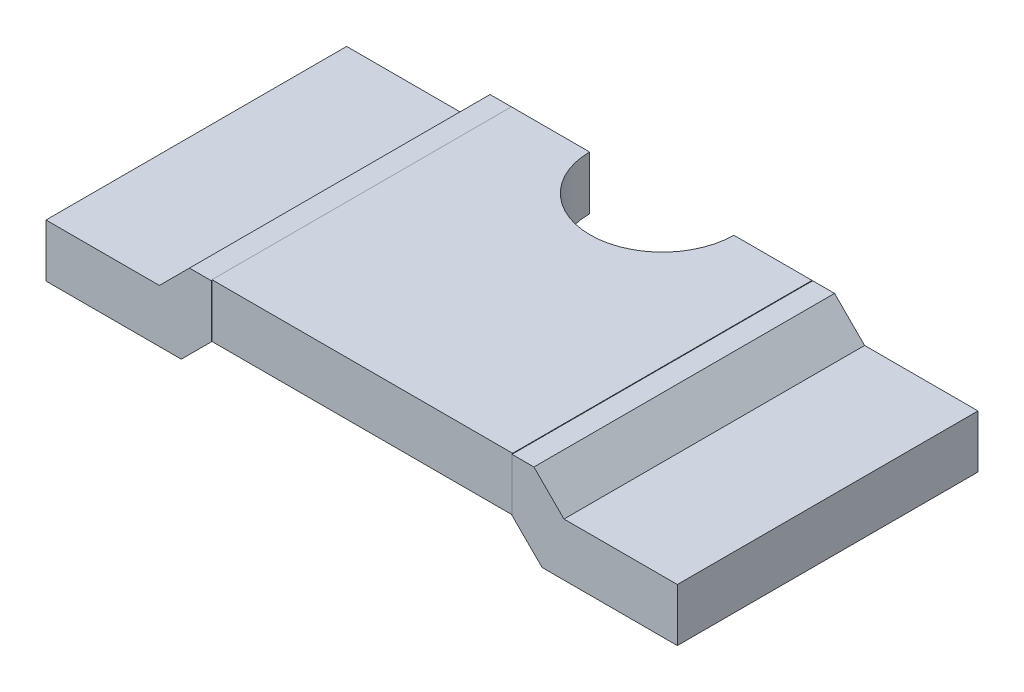
ISO-10303-21;
HEADER;
FILE_DESCRIPTION(('STEP AP214'),'2;1');
FILE_NAME('part.step','',(''),(''),'','','');
FILE_SCHEMA(('AUTOMOTIVE_DESIGN { 1 0 10303 214 1 1 1 1 }'));
ENDSEC;
DATA;
#1=APPLICATION_CONTEXT('core data for automotive mechanical design processes');
#2=APPLICATION_PROTOCOL_DEFINITION('international standard','automotive_design',2000,#1);
#3=PRODUCT_CONTEXT('',#1,'mechanical');
#4=PRODUCT('Part','Part','',(#3));
#5=PRODUCT_RELATED_PRODUCT_CATEGORY('part','',(#4));
#6=PRODUCT_DEFINITION_FORMATION('','',#4);
#7=PRODUCT_DEFINITION_CONTEXT('part definition',#1,'design');
#8=PRODUCT_DEFINITION('design','',#6,#7);
#9=PRODUCT_DEFINITION_SHAPE('','',#8);
#10=(LENGTH_UNIT() NAMED_UNIT(*) SI_UNIT(.MILLI.,.METRE.));
#11=(NAMED_UNIT(*) PLANE_ANGLE_UNIT() SI_UNIT($,.RADIAN.));
#12=(NAMED_UNIT(*) SI_UNIT($,.STERADIAN.) SOLID_ANGLE_UNIT());
#13=UNCERTAINTY_MEASURE_WITH_UNIT(LENGTH_MEASURE(1.E-05),#10,'distance_accuracy_value','');
#14=(GEOMETRIC_REPRESENTATION_CONTEXT(3) GLOBAL_UNCERTAINTY_ASSIGNED_CONTEXT((#13)) GLOBAL_UNIT_ASSIGNED_CONTEXT((#10,
#11,#12)) REPRESENTATION_CONTEXT('',''));
#15=CARTESIAN_POINT('',(0.,0.,0.));
#16=DIRECTION('',(0.,0.,1.));
#17=DIRECTION('',(1.,0.,0.));
#18=AXIS2_PLACEMENT_3D('',#15,#16,#17);
#19=CARTESIAN_POINT('',(0.,1.38,0.));
#20=DIRECTION('',(0.,-1.,0.));
#21=DIRECTION('',(1.,0.,0.));
#22=AXIS2_PLACEMENT_3D('',#19,#20,#21);
#23=CYLINDRICAL_SURFACE('',#22,1.2);
#24=DIRECTION('',(0.,-1.,0.));
#25=VECTOR('',#24,1.);
#26=CARTESIAN_POINT('',(-1.19995833260993,0.945,0.00999999999999979));
#27=LINE('',#26,#25);
#28=CARTESIAN_POINT('',(-1.19995833260993,1.39,0.00999999999999979));
#29=VERTEX_POINT('',#28);
#30=CARTESIAN_POINT('',(-1.19995833260993,0.5,0.00999999999999979));
#31=VERTEX_POINT('',#30);
#32=EDGE_CURVE('E11',#29,#31,#27,.T.);
#33=ORIENTED_EDGE('',*,*,#32,.F.);
#34=CARTESIAN_POINT('',(0.,1.39,0.));
#35=DIRECTION('',(0.,-1.,0.));
#36=DIRECTION('',(1.,0.,0.));
#37=AXIS2_PLACEMENT_3D('',#34,#35,#36);
#38=CIRCLE('',#37,1.2);
#39=CARTESIAN_POINT('',(1.19995833260993,1.39,0.00999999999999979));
#40=VERTEX_POINT('',#39);
#41=EDGE_CURVE('E24',#40,#29,#38,.T.);
#42=ORIENTED_EDGE('',*,*,#41,.F.);
#43=DIRECTION('',(0.,1.,0.));
#44=VECTOR('',#43,1.);
#45=CARTESIAN_POINT('',(1.19995833260993,0.945,0.00999999999999979));
#46=LINE('',#45,#44);
#47=CARTESIAN_POINT('',(1.19995833260993,0.5,0.00999999999999979));
#48=VERTEX_POINT('',#47);
#49=EDGE_CURVE('E350',#48,#40,#46,.T.);
#50=ORIENTED_EDGE('',*,*,#49,.F.);
#51=CARTESIAN_POINT('',(0.,0.5,0.));
#52=DIRECTION('',(0.,1.,0.));
#53=DIRECTION('',(1.,0.,0.));
#54=AXIS2_PLACEMENT_3D('',#51,#52,#53);
#55=CIRCLE('',#54,1.2);
#56=EDGE_CURVE('E37',#31,#48,#55,.T.);
#57=ORIENTED_EDGE('',*,*,#56,.F.);
#58=EDGE_LOOP('',(#33,#42,#50,#57));
#59=FACE_BOUND('',#58,.T.);
#60=ADVANCED_FACE('F17',(#59),#23,.F.);
#61=CARTESIAN_POINT('',(0.,1.39,2.5));
#62=DIRECTION('',(0.,-1.,0.));
#63=DIRECTION('',(0.,0.,-1.));
#64=AXIS2_PLACEMENT_3D('',#61,#62,#63);
#65=PLANE('',#64);
#66=ORIENTED_EDGE('',*,*,#41,.T.);
#67=DIRECTION('',(1.,0.,0.));
#68=VECTOR('',#67,1.);
#69=CARTESIAN_POINT('',(0.,1.39,0.00999999999999979));
#70=LINE('',#69,#68);
#71=CARTESIAN_POINT('',(-2.5,1.39,0.00999999999999979));
#72=VERTEX_POINT('',#71);
#73=EDGE_CURVE('E346',#72,#29,#70,.T.);
#74=ORIENTED_EDGE('',*,*,#73,.F.);
#75=DIRECTION('',(0.,0.,-1.));
#76=VECTOR('',#75,1.);
#77=CARTESIAN_POINT('',(-2.5,1.39,2.5));
#78=LINE('',#77,#76);
#79=CARTESIAN_POINT('',(-2.5,1.39,4.99));
#80=VERTEX_POINT('',#79);
#81=EDGE_CURVE('E343',#80,#72,#78,.T.);
#82=ORIENTED_EDGE('',*,*,#81,.F.);
#83=DIRECTION('',(-1.,0.,0.));
#84=VECTOR('',#83,1.);
#85=CARTESIAN_POINT('',(0.,1.39,4.99));
#86=LINE('',#85,#84);
#87=CARTESIAN_POINT('',(2.5,1.39,4.99));
#88=VERTEX_POINT('',#87);
#89=EDGE_CURVE('E340',#88,#80,#86,.T.);
#90=ORIENTED_EDGE('',*,*,#89,.F.);
#91=DIRECTION('',(0.,0.,-1.));
#92=VECTOR('',#91,1.);
#93=CARTESIAN_POINT('',(2.5,1.39,2.5));
#94=LINE('',#93,#92);
#95=CARTESIAN_POINT('',(2.5,1.39,0.00999999999999979));
#96=VERTEX_POINT('',#95);
#97=EDGE_CURVE('E338',#88,#96,#94,.T.);
#98=ORIENTED_EDGE('',*,*,#97,.T.);
#99=DIRECTION('',(1.,0.,0.));
#100=VECTOR('',#99,1.);
#101=CARTESIAN_POINT('',(0.,1.39,0.00999999999999979));
#102=LINE('',#101,#100);
#103=EDGE_CURVE('E335',#40,#96,#102,.T.);
#104=ORIENTED_EDGE('',*,*,#103,.F.);
#105=EDGE_LOOP('',(#66,#74,#82,#90,#98,#104));
#106=FACE_BOUND('',#105,.T.);
#107=ADVANCED_FACE('F355',(#106),#65,.F.);
#108=CARTESIAN_POINT('',(0.,0.945,0.00999999999999979));
#109=DIRECTION('',(0.,0.,1.));
#110=DIRECTION('',(1.,0.,0.));
#111=AXIS2_PLACEMENT_3D('',#108,#109,#110);
#112=PLANE('',#111);
#113=ORIENTED_EDGE('',*,*,#32,.T.);
#114=DIRECTION('',(-1.,0.,0.));
#115=VECTOR('',#114,1.);
#116=CARTESIAN_POINT('',(0.,0.5,0.00999999999999979));
#117=LINE('',#116,#115);
#118=CARTESIAN_POINT('',(-2.5,0.5,0.00999999999999979));
#119=VERTEX_POINT('',#118);
#120=EDGE_CURVE('E333',#31,#119,#117,.T.);
#121=ORIENTED_EDGE('',*,*,#120,.T.);
#122=DIRECTION('',(0.,-1.,0.));
#123=VECTOR('',#122,1.);
#124=CARTESIAN_POINT('',(-2.5,1.1115,0.00999999999999979));
#125=LINE('',#124,#123);
#126=CARTESIAN_POINT('',(-2.5,1.38,0.00999999999999979));
#127=VERTEX_POINT('',#126);
#128=EDGE_CURVE('E330',#127,#119,#125,.T.);
#129=ORIENTED_EDGE('',*,*,#128,.F.);
#130=DIRECTION('',(0.,1.,0.));
#131=VECTOR('',#130,1.);
#132=CARTESIAN_POINT('',(-2.5,0.945,0.00999999999999979));
#133=LINE('',#132,#131);
#134=EDGE_CURVE('E327',#127,#72,#133,.T.);
#135=ORIENTED_EDGE('',*,*,#134,.T.);
#136=ORIENTED_EDGE('',*,*,#73,.T.);
#137=EDGE_LOOP('',(#113,#121,#129,#135,#136));
#138=FACE_BOUND('',#137,.T.);
#139=ADVANCED_FACE('F428',(#138),#112,.F.);
#140=CARTESIAN_POINT('',(0.,0.945,0.00999999999999979));
#141=DIRECTION('',(0.,0.,1.));
#142=DIRECTION('',(1.,0.,0.));
#143=AXIS2_PLACEMENT_3D('',#140,#141,#142);
#144=PLANE('',#143);
#145=ORIENTED_EDGE('',*,*,#49,.T.);
#146=ORIENTED_EDGE('',*,*,#103,.T.);
#147=DIRECTION('',(0.,-1.,0.));
#148=VECTOR('',#147,1.);
#149=CARTESIAN_POINT('',(2.5,0.945,0.00999999999999979));
#150=LINE('',#149,#148);
#151=CARTESIAN_POINT('',(2.5,1.38,0.00999999999999979));
#152=VERTEX_POINT('',#151);
#153=EDGE_CURVE('E325',#96,#152,#150,.T.);
#154=ORIENTED_EDGE('',*,*,#153,.T.);
#155=DIRECTION('',(0.,1.,0.));
#156=VECTOR('',#155,1.);
#157=CARTESIAN_POINT('',(2.5,1.1115,0.00999999999999979));
#158=LINE('',#157,#156);
#159=CARTESIAN_POINT('',(2.5,0.5,0.00999999999999979));
#160=VERTEX_POINT('',#159);
#161=EDGE_CURVE('E322',#160,#152,#158,.T.);
#162=ORIENTED_EDGE('',*,*,#161,.F.);
#163=DIRECTION('',(-1.,0.,0.));
#164=VECTOR('',#163,1.);
#165=CARTESIAN_POINT('',(0.,0.5,0.00999999999999979));
#166=LINE('',#165,#164);
#167=EDGE_CURVE('E319',#160,#48,#166,.T.);
#168=ORIENTED_EDGE('',*,*,#167,.T.);
#169=EDGE_LOOP('',(#145,#146,#154,#162,#168));
#170=FACE_BOUND('',#169,.T.);
#171=ADVANCED_FACE('F352',(#170),#144,.F.);
#172=CARTESIAN_POINT('',(2.5,0.945,2.5));
#173=DIRECTION('',(-1.,0.,0.));
#174=DIRECTION('',(0.,0.,1.));
#175=AXIS2_PLACEMENT_3D('',#172,#173,#174);
#176=PLANE('',#175);
#177=DIRECTION('',(0.,0.,1.));
#178=VECTOR('',#177,1.);
#179=CARTESIAN_POINT('',(2.5,1.38,1.25));
#180=LINE('',#179,#178);
#181=CARTESIAN_POINT('',(2.5,1.38,4.99));
#182=VERTEX_POINT('',#181);
#183=EDGE_CURVE('E317',#152,#182,#180,.T.);
#184=ORIENTED_EDGE('',*,*,#183,.F.);
#185=ORIENTED_EDGE('',*,*,#153,.F.);
#186=ORIENTED_EDGE('',*,*,#97,.F.);
#187=DIRECTION('',(0.,1.,0.));
#188=VECTOR('',#187,1.);
#189=CARTESIAN_POINT('',(2.5,0.945,4.99));
#190=LINE('',#189,#188);
#191=EDGE_CURVE('E314',#182,#88,#190,.T.);
#192=ORIENTED_EDGE('',*,*,#191,.F.);
#193=EDGE_LOOP('',(#184,#185,#186,#192));
#194=FACE_BOUND('',#193,.T.);
#195=ADVANCED_FACE('F360',(#194),#176,.F.);
#196=CARTESIAN_POINT('',(0.,0.945,4.99));
#197=DIRECTION('',(0.,0.,1.));
#198=DIRECTION('',(1.,0.,0.));
#199=AXIS2_PLACEMENT_3D('',#196,#197,#198);
#200=PLANE('',#199);
#201=DIRECTION('',(0.,-1.,0.));
#202=VECTOR('',#201,1.);
#203=CARTESIAN_POINT('',(2.5,1.1115,4.99));
#204=LINE('',#203,#202);
#205=CARTESIAN_POINT('',(2.5,0.5,4.99));
#206=VERTEX_POINT('',#205);
#207=EDGE_CURVE('E312',#182,#206,#204,.T.);
#208=ORIENTED_EDGE('',*,*,#207,.F.);
#209=ORIENTED_EDGE('',*,*,#191,.T.);
#210=ORIENTED_EDGE('',*,*,#89,.T.);
#211=DIRECTION('',(0.,-1.,0.));
#212=VECTOR('',#211,1.);
#213=CARTESIAN_POINT('',(-2.5,0.945,4.99));
#214=LINE('',#213,#212);
#215=CARTESIAN_POINT('',(-2.5,1.38,4.99));
#216=VERTEX_POINT('',#215);
#217=EDGE_CURVE('E310',#80,#216,#214,.T.);
#218=ORIENTED_EDGE('',*,*,#217,.T.);
#219=DIRECTION('',(0.,1.,0.));
#220=VECTOR('',#219,1.);
#221=CARTESIAN_POINT('',(-2.5,1.1115,4.99));
#222=LINE('',#221,#220);
#223=CARTESIAN_POINT('',(-2.5,0.5,4.99));
#224=VERTEX_POINT('',#223);
#225=EDGE_CURVE('E307',#224,#216,#222,.T.);
#226=ORIENTED_EDGE('',*,*,#225,.F.);
#227=DIRECTION('',(1.,0.,0.));
#228=VECTOR('',#227,1.);
#229=CARTESIAN_POINT('',(0.,0.5,4.99));
#230=LINE('',#229,#228);
#231=EDGE_CURVE('E304',#224,#206,#230,.T.);
#232=ORIENTED_EDGE('',*,*,#231,.T.);
#233=EDGE_LOOP('',(#208,#209,#210,#218,#226,#232));
#234=FACE_BOUND('',#233,.T.);
#235=ADVANCED_FACE('F363',(#234),#200,.T.);
#236=CARTESIAN_POINT('',(0.,0.5,2.5));
#237=DIRECTION('',(0.,1.,0.));
#238=DIRECTION('',(1.,0.,0.));
#239=AXIS2_PLACEMENT_3D('',#236,#237,#238);
#240=PLANE('',#239);
#241=ORIENTED_EDGE('',*,*,#56,.T.);
#242=ORIENTED_EDGE('',*,*,#167,.F.);
#243=DIRECTION('',(0.,0.,1.));
#244=VECTOR('',#243,1.);
#245=CARTESIAN_POINT('',(2.5,0.499999999999999,0.));
#246=LINE('',#245,#244);
#247=EDGE_CURVE('E301',#160,#206,#246,.T.);
#248=ORIENTED_EDGE('',*,*,#247,.T.);
#249=ORIENTED_EDGE('',*,*,#231,.F.);
#250=DIRECTION('',(0.,0.,1.));
#251=VECTOR('',#250,1.);
#252=CARTESIAN_POINT('',(-2.5,0.5,0.));
#253=LINE('',#252,#251);
#254=EDGE_CURVE('E298',#119,#224,#253,.T.);
#255=ORIENTED_EDGE('',*,*,#254,.F.);
#256=ORIENTED_EDGE('',*,*,#120,.F.);
#257=EDGE_LOOP('',(#241,#242,#248,#249,#255,#256));
#258=FACE_BOUND('',#257,.T.);
#259=ADVANCED_FACE('F441',(#258),#240,.F.);
#260=CARTESIAN_POINT('',(-2.5,0.945,2.5));
#261=DIRECTION('',(1.,0.,0.));
#262=DIRECTION('',(0.,1.,0.));
#263=AXIS2_PLACEMENT_3D('',#260,#261,#262);
#264=PLANE('',#263);
#265=DIRECTION('',(0.,0.,-1.));
#266=VECTOR('',#265,1.);
#267=CARTESIAN_POINT('',(-2.5,1.38,1.25));
#268=LINE('',#267,#266);
#269=EDGE_CURVE('E296',#216,#127,#268,.T.);
#270=ORIENTED_EDGE('',*,*,#269,.F.);
#271=ORIENTED_EDGE('',*,*,#217,.F.);
#272=ORIENTED_EDGE('',*,*,#81,.T.);
#273=ORIENTED_EDGE('',*,*,#134,.F.);
#274=EDGE_LOOP('',(#270,#271,#272,#273));
#275=FACE_BOUND('',#274,.T.);
#276=ADVANCED_FACE('F444',(#275),#264,.F.);
#277=CARTESIAN_POINT('',(2.5,1.278,2.5));
#278=DIRECTION('',(-1.,0.,0.));
#279=DIRECTION('',(0.,0.,1.));
#280=AXIS2_PLACEMENT_3D('',#277,#278,#279);
#281=PLANE('',#280);
#282=ORIENTED_EDGE('',*,*,#161,.T.);
#283=DIRECTION('',(0.,0.,1.));
#284=VECTOR('',#283,1.);
#285=CARTESIAN_POINT('',(2.5,1.38,1.25));
#286=LINE('',#285,#284);
#287=CARTESIAN_POINT('',(2.5,1.38,0.));
#288=VERTEX_POINT('',#287);
#289=EDGE_CURVE('E293',#288,#152,#286,.T.);
#290=ORIENTED_EDGE('',*,*,#289,.F.);
#291=DIRECTION('',(0.,1.,0.));
#292=VECTOR('',#291,1.);
#293=CARTESIAN_POINT('',(2.5,0.987698847724716,0.));
#294=LINE('',#293,#292);
#295=CARTESIAN_POINT('',(2.5,0.499999999999999,0.));
#296=VERTEX_POINT('',#295);
#297=EDGE_CURVE('E290',#296,#288,#294,.T.);
#298=ORIENTED_EDGE('',*,*,#297,.F.);
#299=DIRECTION('',(0.,0.,1.));
#300=VECTOR('',#299,1.);
#301=CARTESIAN_POINT('',(2.5,0.499999999999999,0.));
#302=LINE('',#301,#300);
#303=EDGE_CURVE('E287',#296,#160,#302,.T.);
#304=ORIENTED_EDGE('',*,*,#303,.T.);
#305=EDGE_LOOP('',(#282,#290,#298,#304));
#306=FACE_BOUND('',#305,.T.);
#307=ADVANCED_FACE('F448',(#306),#281,.T.);
#308=CARTESIAN_POINT('',(2.5,1.278,2.5));
#309=DIRECTION('',(-1.,0.,0.));
#310=DIRECTION('',(0.,0.,1.));
#311=AXIS2_PLACEMENT_3D('',#308,#309,#310);
#312=PLANE('',#311);
#313=ORIENTED_EDGE('',*,*,#207,.T.);
#314=DIRECTION('',(0.,0.,1.));
#315=VECTOR('',#314,1.);
#316=CARTESIAN_POINT('',(2.5,0.499999999999999,0.));
#317=LINE('',#316,#315);
#318=CARTESIAN_POINT('',(2.5,0.499999999999999,5.));
#319=VERTEX_POINT('',#318);
#320=EDGE_CURVE('E285',#206,#319,#317,.T.);
#321=ORIENTED_EDGE('',*,*,#320,.T.);
#322=DIRECTION('',(0.,-1.,0.));
#323=VECTOR('',#322,1.);
#324=CARTESIAN_POINT('',(2.5,0.987698847724716,5.));
#325=LINE('',#324,#323);
#326=CARTESIAN_POINT('',(2.5,1.38,5.));
#327=VERTEX_POINT('',#326);
#328=EDGE_CURVE('E282',#327,#319,#325,.T.);
#329=ORIENTED_EDGE('',*,*,#328,.F.);
#330=DIRECTION('',(0.,0.,1.));
#331=VECTOR('',#330,1.);
#332=CARTESIAN_POINT('',(2.5,1.38,1.25));
#333=LINE('',#332,#331);
#334=EDGE_CURVE('E279',#182,#327,#333,.T.);
#335=ORIENTED_EDGE('',*,*,#334,.F.);
#336=EDGE_LOOP('',(#313,#321,#329,#335));
#337=FACE_BOUND('',#336,.T.);
#338=ADVANCED_FACE('F368',(#337),#312,.T.);
#339=CARTESIAN_POINT('',(-2.5,1.278,2.5));
#340=DIRECTION('',(1.,0.,0.));
#341=DIRECTION('',(0.,0.,1.));
#342=AXIS2_PLACEMENT_3D('',#339,#340,#341);
#343=PLANE('',#342);
#344=ORIENTED_EDGE('',*,*,#128,.T.);
#345=DIRECTION('',(0.,0.,1.));
#346=VECTOR('',#345,1.);
#347=CARTESIAN_POINT('',(-2.5,0.5,0.));
#348=LINE('',#347,#346);
#349=CARTESIAN_POINT('',(-2.5,0.5,0.));
#350=VERTEX_POINT('',#349);
#351=EDGE_CURVE('E276',#350,#119,#348,.T.);
#352=ORIENTED_EDGE('',*,*,#351,.F.);
#353=DIRECTION('',(0.,-1.,0.));
#354=VECTOR('',#353,1.);
#355=CARTESIAN_POINT('',(-2.5,0.649698847724716,0.));
#356=LINE('',#355,#354);
#357=CARTESIAN_POINT('',(-2.5,1.38,0.));
#358=VERTEX_POINT('',#357);
#359=EDGE_CURVE('E274',#358,#350,#356,.T.);
#360=ORIENTED_EDGE('',*,*,#359,.F.);
#361=DIRECTION('',(0.,0.,-1.));
#362=VECTOR('',#361,1.);
#363=CARTESIAN_POINT('',(-2.5,1.38,1.25));
#364=LINE('',#363,#362);
#365=EDGE_CURVE('E185',#127,#358,#364,.T.);
#366=ORIENTED_EDGE('',*,*,#365,.F.);
#367=EDGE_LOOP('',(#344,#352,#360,#366));
#368=FACE_BOUND('',#367,.T.);
#369=ADVANCED_FACE('F455',(#368),#343,.T.);
#370=CARTESIAN_POINT('',(-2.5,1.278,2.5));
#371=DIRECTION('',(1.,0.,0.));
#372=DIRECTION('',(0.,0.,1.));
#373=AXIS2_PLACEMENT_3D('',#370,#371,#372);
#374=PLANE('',#373);
#375=ORIENTED_EDGE('',*,*,#225,.T.);
#376=DIRECTION('',(0.,0.,-1.));
#377=VECTOR('',#376,1.);
#378=CARTESIAN_POINT('',(-2.5,1.38,1.25));
#379=LINE('',#378,#377);
#380=CARTESIAN_POINT('',(-2.5,1.38,5.));
#381=VERTEX_POINT('',#380);
#382=EDGE_CURVE('E271',#381,#216,#379,.T.);
#383=ORIENTED_EDGE('',*,*,#382,.F.);
#384=DIRECTION('',(0.,1.,0.));
#385=VECTOR('',#384,1.);
#386=CARTESIAN_POINT('',(-2.5,0.649698847724716,5.));
#387=LINE('',#386,#385);
#388=CARTESIAN_POINT('',(-2.5,0.5,5.));
#389=VERTEX_POINT('',#388);
#390=EDGE_CURVE('E268',#389,#381,#387,.T.);
#391=ORIENTED_EDGE('',*,*,#390,.F.);
#392=DIRECTION('',(0.,0.,1.));
#393=VECTOR('',#392,1.);
#394=CARTESIAN_POINT('',(-2.5,0.5,0.));
#395=LINE('',#394,#393);
#396=EDGE_CURVE('E265',#224,#389,#395,.T.);
#397=ORIENTED_EDGE('',*,*,#396,.F.);
#398=EDGE_LOOP('',(#375,#383,#391,#397));
#399=FACE_BOUND('',#398,.T.);
#400=ADVANCED_FACE('F458',(#399),#374,.T.);
#401=CARTESIAN_POINT('',(0.,0.697397695449432,5.));
#402=DIRECTION('',(0.,0.,1.));
#403=DIRECTION('',(1.,0.,0.));
#404=AXIS2_PLACEMENT_3D('',#401,#402,#403);
#405=PLANE('',#404);
#406=ORIENTED_EDGE('',*,*,#328,.T.);
#407=DIRECTION('',(-0.707106781186547,0.707106781186548,0.));
#408=VECTOR('',#407,1.);
#409=CARTESIAN_POINT('',(3.,0.,5.));
#410=LINE('',#409,#408);
#411=CARTESIAN_POINT('',(3.,0.,5.));
#412=VERTEX_POINT('',#411);
#413=EDGE_CURVE('E262',#412,#319,#410,.T.);
#414=ORIENTED_EDGE('',*,*,#413,.F.);
#415=DIRECTION('',(-1.,0.,0.));
#416=VECTOR('',#415,1.);
#417=CARTESIAN_POINT('',(5.25,0.,5.));
#418=LINE('',#417,#416);
#419=CARTESIAN_POINT('',(5.25,0.,5.));
#420=VERTEX_POINT('',#419);
#421=EDGE_CURVE('E259',#420,#412,#418,.T.);
#422=ORIENTED_EDGE('',*,*,#421,.F.);
#423=DIRECTION('',(0.,-1.,0.));
#424=VECTOR('',#423,1.);
#425=CARTESIAN_POINT('',(5.25,0.879999999999999,5.));
#426=LINE('',#425,#424);
#427=CARTESIAN_POINT('',(5.25,0.879999999999999,5.));
#428=VERTEX_POINT('',#427);
#429=EDGE_CURVE('E256',#428,#420,#426,.T.);
#430=ORIENTED_EDGE('',*,*,#429,.F.);
#431=DIRECTION('',(1.,0.,0.));
#432=VECTOR('',#431,1.);
#433=CARTESIAN_POINT('',(5.25,0.879999999999999,5.));
#434=LINE('',#433,#432);
#435=CARTESIAN_POINT('',(3.3645,0.879999999999999,5.));
#436=VERTEX_POINT('',#435);
#437=EDGE_CURVE('E253',#436,#428,#434,.T.);
#438=ORIENTED_EDGE('',*,*,#437,.F.);
#439=DIRECTION('',(0.707106781186547,-0.707106781186548,0.));
#440=VECTOR('',#439,1.);
#441=CARTESIAN_POINT('',(2.8645,1.38,5.));
#442=LINE('',#441,#440);
#443=CARTESIAN_POINT('',(2.8645,1.38,5.));
#444=VERTEX_POINT('',#443);
#445=EDGE_CURVE('E250',#444,#436,#442,.T.);
#446=ORIENTED_EDGE('',*,*,#445,.F.);
#447=DIRECTION('',(1.,0.,0.));
#448=VECTOR('',#447,1.);
#449=CARTESIAN_POINT('',(-2.8645,1.38,5.));
#450=LINE('',#449,#448);
#451=EDGE_CURVE('E247',#327,#444,#450,.T.);
#452=ORIENTED_EDGE('',*,*,#451,.F.);
#453=EDGE_LOOP('',(#406,#414,#422,#430,#438,#446,#452));
#454=FACE_BOUND('',#453,.T.);
#455=ADVANCED_FACE('F374',(#454),#405,.T.);
#456=CARTESIAN_POINT('',(0.,0.697397695449432,5.));
#457=DIRECTION('',(0.,0.,1.));
#458=DIRECTION('',(1.,0.,0.));
#459=AXIS2_PLACEMENT_3D('',#456,#457,#458);
#460=PLANE('',#459);
#461=ORIENTED_EDGE('',*,*,#390,.T.);
#462=DIRECTION('',(1.,0.,0.));
#463=VECTOR('',#462,1.);
#464=CARTESIAN_POINT('',(-2.8645,1.38,5.));
#465=LINE('',#464,#463);
#466=CARTESIAN_POINT('',(-2.8645,1.38,5.));
#467=VERTEX_POINT('',#466);
#468=EDGE_CURVE('E245',#467,#381,#465,.T.);
#469=ORIENTED_EDGE('',*,*,#468,.F.);
#470=DIRECTION('',(0.707106781186548,0.707106781186548,0.));
#471=VECTOR('',#470,1.);
#472=CARTESIAN_POINT('',(-2.8645,1.38,5.));
#473=LINE('',#472,#471);
#474=CARTESIAN_POINT('',(-3.3645,0.88,5.));
#475=VERTEX_POINT('',#474);
#476=EDGE_CURVE('E190',#475,#467,#473,.T.);
#477=ORIENTED_EDGE('',*,*,#476,.F.);
#478=DIRECTION('',(1.,0.,0.));
#479=VECTOR('',#478,1.);
#480=CARTESIAN_POINT('',(-5.25,0.88,5.));
#481=LINE('',#480,#479);
#482=CARTESIAN_POINT('',(-5.25,0.88,5.));
#483=VERTEX_POINT('',#482);
#484=EDGE_CURVE('E241',#483,#475,#481,.T.);
#485=ORIENTED_EDGE('',*,*,#484,.F.);
#486=DIRECTION('',(0.,1.,0.));
#487=VECTOR('',#486,1.);
#488=CARTESIAN_POINT('',(-5.25,0.88,5.));
#489=LINE('',#488,#487);
#490=CARTESIAN_POINT('',(-5.25,0.,5.));
#491=VERTEX_POINT('',#490);
#492=EDGE_CURVE('E238',#491,#483,#489,.T.);
#493=ORIENTED_EDGE('',*,*,#492,.F.);
#494=DIRECTION('',(-1.,0.,0.));
#495=VECTOR('',#494,1.);
#496=CARTESIAN_POINT('',(-5.25,0.,5.));
#497=LINE('',#496,#495);
#498=CARTESIAN_POINT('',(-3.,0.,5.));
#499=VERTEX_POINT('',#498);
#500=EDGE_CURVE('E235',#499,#491,#497,.T.);
#501=ORIENTED_EDGE('',*,*,#500,.F.);
#502=DIRECTION('',(-0.707106781186548,-0.707106781186548,0.));
#503=VECTOR('',#502,1.);
#504=CARTESIAN_POINT('',(-3.,0.,5.));
#505=LINE('',#504,#503);
#506=EDGE_CURVE('E232',#389,#499,#505,.T.);
#507=ORIENTED_EDGE('',*,*,#506,.F.);
#508=EDGE_LOOP('',(#461,#469,#477,#485,#493,#501,#507));
#509=FACE_BOUND('',#508,.T.);
#510=ADVANCED_FACE('F409',(#509),#460,.T.);
#511=CARTESIAN_POINT('',(0.,0.697397695449432,0.));
#512=DIRECTION('',(0.,0.,1.));
#513=DIRECTION('',(1.,0.,0.));
#514=AXIS2_PLACEMENT_3D('',#511,#512,#513);
#515=PLANE('',#514);
#516=ORIENTED_EDGE('',*,*,#297,.T.);
#517=DIRECTION('',(1.,0.,0.));
#518=VECTOR('',#517,1.);
#519=CARTESIAN_POINT('',(-2.8645,1.38,0.));
#520=LINE('',#519,#518);
#521=CARTESIAN_POINT('',(2.8645,1.38,0.));
#522=VERTEX_POINT('',#521);
#523=EDGE_CURVE('E230',#288,#522,#520,.T.);
#524=ORIENTED_EDGE('',*,*,#523,.T.);
#525=DIRECTION('',(0.707106781186547,-0.707106781186548,0.));
#526=VECTOR('',#525,1.);
#527=CARTESIAN_POINT('',(2.8645,1.38,0.));
#528=LINE('',#527,#526);
#529=CARTESIAN_POINT('',(3.3645,0.879999999999999,0.));
#530=VERTEX_POINT('',#529);
#531=EDGE_CURVE('E228',#522,#530,#528,.T.);
#532=ORIENTED_EDGE('',*,*,#531,.T.);
#533=DIRECTION('',(-1.,0.,0.));
#534=VECTOR('',#533,1.);
#535=CARTESIAN_POINT('',(5.25,0.879999999999999,0.));
#536=LINE('',#535,#534);
#537=CARTESIAN_POINT('',(5.25,0.879999999999999,0.));
#538=VERTEX_POINT('',#537);
#539=EDGE_CURVE('E225',#538,#530,#536,.T.);
#540=ORIENTED_EDGE('',*,*,#539,.F.);
#541=DIRECTION('',(0.,-1.,0.));
#542=VECTOR('',#541,1.);
#543=CARTESIAN_POINT('',(5.25,0.879999999999999,0.));
#544=LINE('',#543,#542);
#545=CARTESIAN_POINT('',(5.25,0.,0.));
#546=VERTEX_POINT('',#545);
#547=EDGE_CURVE('E223',#538,#546,#544,.T.);
#548=ORIENTED_EDGE('',*,*,#547,.T.);
#549=DIRECTION('',(-1.,0.,0.));
#550=VECTOR('',#549,1.);
#551=CARTESIAN_POINT('',(5.25,0.,0.));
#552=LINE('',#551,#550);
#553=CARTESIAN_POINT('',(3.,0.,0.));
#554=VERTEX_POINT('',#553);
#555=EDGE_CURVE('E221',#546,#554,#552,.T.);
#556=ORIENTED_EDGE('',*,*,#555,.T.);
#557=DIRECTION('',(-0.707106781186547,0.707106781186548,0.));
#558=VECTOR('',#557,1.);
#559=CARTESIAN_POINT('',(3.,0.,0.));
#560=LINE('',#559,#558);
#561=EDGE_CURVE('E218',#554,#296,#560,.T.);
#562=ORIENTED_EDGE('',*,*,#561,.T.);
#563=EDGE_LOOP('',(#516,#524,#532,#540,#548,#556,#562));
#564=FACE_BOUND('',#563,.T.);
#565=ADVANCED_FACE('F385',(#564),#515,.F.);
#566=CARTESIAN_POINT('',(0.,0.697397695449432,0.));
#567=DIRECTION('',(0.,0.,1.));
#568=DIRECTION('',(1.,0.,0.));
#569=AXIS2_PLACEMENT_3D('',#566,#567,#568);
#570=PLANE('',#569);
#571=ORIENTED_EDGE('',*,*,#359,.T.);
#572=DIRECTION('',(0.707106781186548,0.707106781186548,0.));
#573=VECTOR('',#572,1.);
#574=CARTESIAN_POINT('',(-3.,0.,0.));
#575=LINE('',#574,#573);
#576=CARTESIAN_POINT('',(-3.,0.,0.));
#577=VERTEX_POINT('',#576);
#578=EDGE_CURVE('E215',#577,#350,#575,.T.);
#579=ORIENTED_EDGE('',*,*,#578,.F.);
#580=DIRECTION('',(1.,0.,0.));
#581=VECTOR('',#580,1.);
#582=CARTESIAN_POINT('',(-5.25,0.,0.));
#583=LINE('',#582,#581);
#584=CARTESIAN_POINT('',(-5.25,0.,0.));
#585=VERTEX_POINT('',#584);
#586=EDGE_CURVE('E212',#585,#577,#583,.T.);
#587=ORIENTED_EDGE('',*,*,#586,.F.);
#588=DIRECTION('',(0.,-1.,0.));
#589=VECTOR('',#588,1.);
#590=CARTESIAN_POINT('',(-5.25,0.88,0.));
#591=LINE('',#590,#589);
#592=CARTESIAN_POINT('',(-5.25,0.88,0.));
#593=VERTEX_POINT('',#592);
#594=EDGE_CURVE('E209',#593,#585,#591,.T.);
#595=ORIENTED_EDGE('',*,*,#594,.F.);
#596=DIRECTION('',(1.,0.,0.));
#597=VECTOR('',#596,1.);
#598=CARTESIAN_POINT('',(-5.25,0.88,0.));
#599=LINE('',#598,#597);
#600=CARTESIAN_POINT('',(-3.3645,0.88,0.));
#601=VERTEX_POINT('',#600);
#602=EDGE_CURVE('E170',#593,#601,#599,.T.);
#603=ORIENTED_EDGE('',*,*,#602,.T.);
#604=DIRECTION('',(-0.707106781186548,-0.707106781186548,0.));
#605=VECTOR('',#604,1.);
#606=CARTESIAN_POINT('',(-2.8645,1.38,0.));
#607=LINE('',#606,#605);
#608=CARTESIAN_POINT('',(-2.8645,1.38,0.));
#609=VERTEX_POINT('',#608);
#610=EDGE_CURVE('E164',#609,#601,#607,.T.);
#611=ORIENTED_EDGE('',*,*,#610,.F.);
#612=DIRECTION('',(1.,0.,0.));
#613=VECTOR('',#612,1.);
#614=CARTESIAN_POINT('',(-2.8645,1.38,0.));
#615=LINE('',#614,#613);
#616=EDGE_CURVE('E168',#609,#358,#615,.T.);
#617=ORIENTED_EDGE('',*,*,#616,.T.);
#618=EDGE_LOOP('',(#571,#579,#587,#595,#603,#611,#617));
#619=FACE_BOUND('',#618,.T.);
#620=ADVANCED_FACE('F167',(#619),#570,.F.);
#621=CARTESIAN_POINT('',(1.43225,1.38,0.));
#622=DIRECTION('',(0.,1.,0.));
#623=DIRECTION('',(1.,0.,0.));
#624=AXIS2_PLACEMENT_3D('',#621,#622,#623);
#625=PLANE('',#624);
#626=ORIENTED_EDGE('',*,*,#289,.T.);
#627=ORIENTED_EDGE('',*,*,#183,.T.);
#628=ORIENTED_EDGE('',*,*,#334,.T.);
#629=ORIENTED_EDGE('',*,*,#451,.T.);
#630=DIRECTION('',(0.,0.,1.));
#631=VECTOR('',#630,1.);
#632=CARTESIAN_POINT('',(2.8645,1.38,0.));
#633=LINE('',#632,#631);
#634=EDGE_CURVE('E186',#522,#444,#633,.T.);
#635=ORIENTED_EDGE('',*,*,#634,.F.);
#636=ORIENTED_EDGE('',*,*,#523,.F.);
#637=EDGE_LOOP('',(#626,#627,#628,#629,#635,#636));
#638=FACE_BOUND('',#637,.T.);
#639=ADVANCED_FACE('F371',(#638),#625,.T.);
#640=CARTESIAN_POINT('',(-5.25,0.44,0.));
#641=DIRECTION('',(-1.,0.,0.));
#642=DIRECTION('',(0.,1.,0.));
#643=AXIS2_PLACEMENT_3D('',#640,#641,#642);
#644=PLANE('',#643);
#645=ORIENTED_EDGE('',*,*,#492,.T.);
#646=DIRECTION('',(0.,0.,1.));
#647=VECTOR('',#646,1.);
#648=CARTESIAN_POINT('',(-5.25,0.88,0.));
#649=LINE('',#648,#647);
#650=EDGE_CURVE('E203',#593,#483,#649,.T.);
#651=ORIENTED_EDGE('',*,*,#650,.F.);
#652=ORIENTED_EDGE('',*,*,#594,.T.);
#653=DIRECTION('',(0.,0.,1.));
#654=VECTOR('',#653,1.);
#655=CARTESIAN_POINT('',(-5.25,0.,0.));
#656=LINE('',#655,#654);
#657=EDGE_CURVE('E194',#585,#491,#656,.T.);
#658=ORIENTED_EDGE('',*,*,#657,.T.);
#659=EDGE_LOOP('',(#645,#651,#652,#658));
#660=FACE_BOUND('',#659,.T.);
#661=ADVANCED_FACE('F412',(#660),#644,.T.);
#662=CARTESIAN_POINT('',(-4.30725,0.88,0.));
#663=DIRECTION('',(0.,1.,0.));
#664=DIRECTION('',(1.,0.,0.));
#665=AXIS2_PLACEMENT_3D('',#662,#663,#664);
#666=PLANE('',#665);
#667=ORIENTED_EDGE('',*,*,#484,.T.);
#668=DIRECTION('',(0.,0.,1.));
#669=VECTOR('',#668,1.);
#670=CARTESIAN_POINT('',(-3.3645,0.88,0.));
#671=LINE('',#670,#669);
#672=EDGE_CURVE('E191',#601,#475,#671,.T.);
#673=ORIENTED_EDGE('',*,*,#672,.F.);
#674=ORIENTED_EDGE('',*,*,#602,.F.);
#675=ORIENTED_EDGE('',*,*,#650,.T.);
#676=EDGE_LOOP('',(#667,#673,#674,#675));
#677=FACE_BOUND('',#676,.T.);
#678=ADVANCED_FACE('F414',(#677),#666,.T.);
#679=CARTESIAN_POINT('',(-3.1145,1.13,0.));
#680=DIRECTION('',(-0.707106781186548,0.707106781186548,0.));
#681=DIRECTION('',(0.,0.,1.));
#682=AXIS2_PLACEMENT_3D('',#679,#680,#681);
#683=PLANE('',#682);
#684=ORIENTED_EDGE('',*,*,#476,.T.);
#685=DIRECTION('',(0.,0.,1.));
#686=VECTOR('',#685,1.);
#687=CARTESIAN_POINT('',(-2.8645,1.38,0.));
#688=LINE('',#687,#686);
#689=EDGE_CURVE('E182',#609,#467,#688,.T.);
#690=ORIENTED_EDGE('',*,*,#689,.F.);
#691=ORIENTED_EDGE('',*,*,#610,.T.);
#692=ORIENTED_EDGE('',*,*,#672,.T.);
#693=EDGE_LOOP('',(#684,#690,#691,#692));
#694=FACE_BOUND('',#693,.T.);
#695=ADVANCED_FACE('F189',(#694),#683,.T.);
#696=CARTESIAN_POINT('',(1.43225,1.38,0.));
#697=DIRECTION('',(0.,1.,0.));
#698=DIRECTION('',(1.,0.,0.));
#699=AXIS2_PLACEMENT_3D('',#696,#697,#698);
#700=PLANE('',#699);
#701=ORIENTED_EDGE('',*,*,#382,.T.);
#702=ORIENTED_EDGE('',*,*,#269,.T.);
#703=ORIENTED_EDGE('',*,*,#365,.T.);
#704=ORIENTED_EDGE('',*,*,#616,.F.);
#705=ORIENTED_EDGE('',*,*,#689,.T.);
#706=ORIENTED_EDGE('',*,*,#468,.T.);
#707=EDGE_LOOP('',(#701,#702,#703,#704,#705,#706));
#708=FACE_BOUND('',#707,.T.);
#709=ADVANCED_FACE('F180',(#708),#700,.T.);
#710=CARTESIAN_POINT('',(3.1145,1.13,0.));
#711=DIRECTION('',(0.707106781186548,0.707106781186547,0.));
#712=DIRECTION('',(0.,0.,-1.));
#713=AXIS2_PLACEMENT_3D('',#710,#711,#712);
#714=PLANE('',#713);
#715=ORIENTED_EDGE('',*,*,#445,.T.);
#716=DIRECTION('',(0.,0.,1.));
#717=VECTOR('',#716,1.);
#718=CARTESIAN_POINT('',(3.3645,0.879999999999999,0.));
#719=LINE('',#718,#717);
#720=EDGE_CURVE('E192',#530,#436,#719,.T.);
#721=ORIENTED_EDGE('',*,*,#720,.F.);
#722=ORIENTED_EDGE('',*,*,#531,.F.);
#723=ORIENTED_EDGE('',*,*,#634,.T.);
#724=EDGE_LOOP('',(#715,#721,#722,#723));
#725=FACE_BOUND('',#724,.T.);
#726=ADVANCED_FACE('F377',(#725),#714,.T.);
#727=CARTESIAN_POINT('',(4.30725,0.879999999999999,0.));
#728=DIRECTION('',(0.,1.,0.));
#729=DIRECTION('',(1.,0.,0.));
#730=AXIS2_PLACEMENT_3D('',#727,#728,#729);
#731=PLANE('',#730);
#732=ORIENTED_EDGE('',*,*,#437,.T.);
#733=DIRECTION('',(0.,0.,1.));
#734=VECTOR('',#733,1.);
#735=CARTESIAN_POINT('',(5.25,0.879999999999999,0.));
#736=LINE('',#735,#734);
#737=EDGE_CURVE('E197',#538,#428,#736,.T.);
#738=ORIENTED_EDGE('',*,*,#737,.F.);
#739=ORIENTED_EDGE('',*,*,#539,.T.);
#740=ORIENTED_EDGE('',*,*,#720,.T.);
#741=EDGE_LOOP('',(#732,#738,#739,#740));
#742=FACE_BOUND('',#741,.T.);
#743=ADVANCED_FACE('F380',(#742),#731,.T.);
#744=CARTESIAN_POINT('',(5.25,0.439999999999999,0.));
#745=DIRECTION('',(1.,0.,0.));
#746=DIRECTION('',(0.,1.,0.));
#747=AXIS2_PLACEMENT_3D('',#744,#745,#746);
#748=PLANE('',#747);
#749=ORIENTED_EDGE('',*,*,#429,.T.);
#750=DIRECTION('',(0.,0.,1.));
#751=VECTOR('',#750,1.);
#752=CARTESIAN_POINT('',(5.25,0.,0.));
#753=LINE('',#752,#751);
#754=EDGE_CURVE('E391',#546,#420,#753,.T.);
#755=ORIENTED_EDGE('',*,*,#754,.F.);
#756=ORIENTED_EDGE('',*,*,#547,.F.);
#757=ORIENTED_EDGE('',*,*,#737,.T.);
#758=EDGE_LOOP('',(#749,#755,#756,#757));
#759=FACE_BOUND('',#758,.T.);
#760=ADVANCED_FACE('F389',(#759),#748,.T.);
#761=CARTESIAN_POINT('',(4.125,0.,0.));
#762=DIRECTION('',(0.,-1.,0.));
#763=DIRECTION('',(-1.,0.,0.));
#764=AXIS2_PLACEMENT_3D('',#761,#762,#763);
#765=PLANE('',#764);
#766=ORIENTED_EDGE('',*,*,#421,.T.);
#767=DIRECTION('',(0.,0.,1.));
#768=VECTOR('',#767,1.);
#769=CARTESIAN_POINT('',(3.,0.,0.));
#770=LINE('',#769,#768);
#771=EDGE_CURVE('E393',#554,#412,#770,.T.);
#772=ORIENTED_EDGE('',*,*,#771,.F.);
#773=ORIENTED_EDGE('',*,*,#555,.F.);
#774=ORIENTED_EDGE('',*,*,#754,.T.);
#775=EDGE_LOOP('',(#766,#772,#773,#774));
#776=FACE_BOUND('',#775,.T.);
#777=ADVANCED_FACE('F531',(#776),#765,.T.);
#778=CARTESIAN_POINT('',(2.75,0.249999999999999,0.));
#779=DIRECTION('',(-0.707106781186548,-0.707106781186547,0.));
#780=DIRECTION('',(-0.707106781186547,0.707106781186548,0.));
#781=AXIS2_PLACEMENT_3D('',#778,#779,#780);
#782=PLANE('',#781);
#783=ORIENTED_EDGE('',*,*,#413,.T.);
#784=ORIENTED_EDGE('',*,*,#320,.F.);
#785=ORIENTED_EDGE('',*,*,#247,.F.);
#786=ORIENTED_EDGE('',*,*,#303,.F.);
#787=ORIENTED_EDGE('',*,*,#561,.F.);
#788=ORIENTED_EDGE('',*,*,#771,.T.);
#789=EDGE_LOOP('',(#783,#784,#785,#786,#787,#788));
#790=FACE_BOUND('',#789,.T.);
#791=ADVANCED_FACE('F540',(#790),#782,.T.);
#792=CARTESIAN_POINT('',(-2.75,0.25,0.));
#793=DIRECTION('',(0.707106781186548,-0.707106781186548,0.));
#794=DIRECTION('',(0.,0.,-1.));
#795=AXIS2_PLACEMENT_3D('',#792,#793,#794);
#796=PLANE('',#795);
#797=ORIENTED_EDGE('',*,*,#506,.T.);
#798=DIRECTION('',(0.,0.,1.));
#799=VECTOR('',#798,1.);
#800=CARTESIAN_POINT('',(-3.,0.,0.));
#801=LINE('',#800,#799);
#802=EDGE_CURVE('E396',#577,#499,#801,.T.);
#803=ORIENTED_EDGE('',*,*,#802,.F.);
#804=ORIENTED_EDGE('',*,*,#578,.T.);
#805=ORIENTED_EDGE('',*,*,#351,.T.);
#806=ORIENTED_EDGE('',*,*,#254,.T.);
#807=ORIENTED_EDGE('',*,*,#396,.T.);
#808=EDGE_LOOP('',(#797,#803,#804,#805,#806,#807));
#809=FACE_BOUND('',#808,.T.);
#810=ADVANCED_FACE('F405',(#809),#796,.T.);
#811=CARTESIAN_POINT('',(-4.125,0.,0.));
#812=DIRECTION('',(0.,-1.,0.));
#813=DIRECTION('',(0.,0.,-1.));
#814=AXIS2_PLACEMENT_3D('',#811,#812,#813);
#815=PLANE('',#814);
#816=ORIENTED_EDGE('',*,*,#500,.T.);
#817=ORIENTED_EDGE('',*,*,#657,.F.);
#818=ORIENTED_EDGE('',*,*,#586,.T.);
#819=ORIENTED_EDGE('',*,*,#802,.T.);
#820=EDGE_LOOP('',(#816,#817,#818,#819));
#821=FACE_BOUND('',#820,.T.);
#822=ADVANCED_FACE('F402',(#821),#815,.T.);
#823=CLOSED_SHELL('',(#60,#107,#139,#171,#195,#235,#259,#276,#307,#338,#369,#400,#455,#510,#565,
#620,#639,#661,#678,#695,#709,#726,#743,#760,#777,#791,#810,#822));
#824=MANIFOLD_SOLID_BREP('B1',#823);
#825=ADVANCED_BREP_SHAPE_REPRESENTATION('',(#18,#824),#14);
#826=SHAPE_DEFINITION_REPRESENTATION(#9,#825);
ENDSEC;
END-ISO-10303-21;
